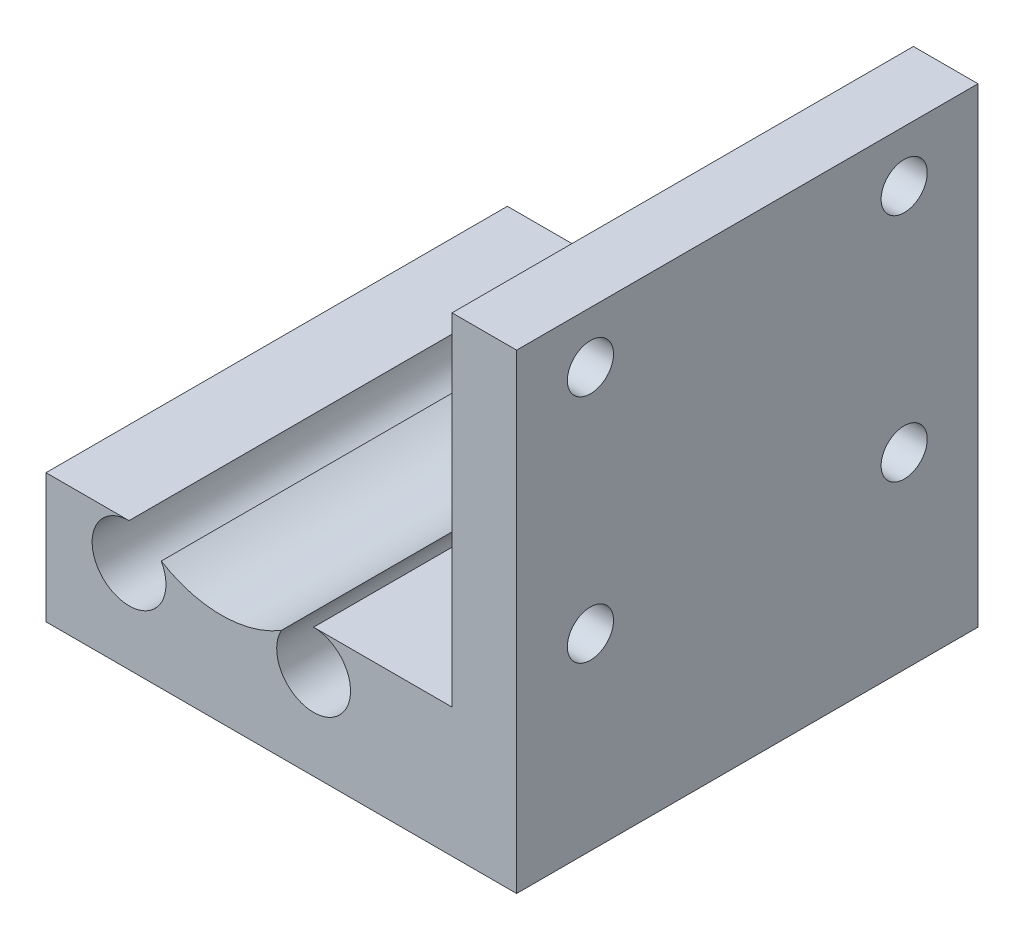
ISO-10303-21;
HEADER;
FILE_DESCRIPTION(('STEP AP214'),'2;1');
FILE_NAME('part.step','',(''),(''),'','','');
FILE_SCHEMA(('AUTOMOTIVE_DESIGN { 1 0 10303 214 1 1 1 1 }'));
ENDSEC;
DATA;
#1=APPLICATION_CONTEXT('core data for automotive mechanical design processes');
#2=APPLICATION_PROTOCOL_DEFINITION('international standard','automotive_design',2000,#1);
#3=PRODUCT_CONTEXT('',#1,'mechanical');
#4=PRODUCT('Part','Part','',(#3));
#5=PRODUCT_RELATED_PRODUCT_CATEGORY('part','',(#4));
#6=PRODUCT_DEFINITION_FORMATION('','',#4);
#7=PRODUCT_DEFINITION_CONTEXT('part definition',#1,'design');
#8=PRODUCT_DEFINITION('design','',#6,#7);
#9=PRODUCT_DEFINITION_SHAPE('','',#8);
#10=(LENGTH_UNIT() NAMED_UNIT(*) SI_UNIT(.MILLI.,.METRE.));
#11=(NAMED_UNIT(*) PLANE_ANGLE_UNIT() SI_UNIT($,.RADIAN.));
#12=(NAMED_UNIT(*) SI_UNIT($,.STERADIAN.) SOLID_ANGLE_UNIT());
#13=UNCERTAINTY_MEASURE_WITH_UNIT(LENGTH_MEASURE(1.E-05),#10,'distance_accuracy_value','');
#14=(GEOMETRIC_REPRESENTATION_CONTEXT(3) GLOBAL_UNCERTAINTY_ASSIGNED_CONTEXT((#13)) GLOBAL_UNIT_ASSIGNED_CONTEXT((#10,
#11,#12)) REPRESENTATION_CONTEXT('',''));
#15=CARTESIAN_POINT('',(0.,0.,0.));
#16=DIRECTION('',(0.,0.,1.));
#17=DIRECTION('',(1.,0.,0.));
#18=AXIS2_PLACEMENT_3D('',#15,#16,#17);
#19=CARTESIAN_POINT('',(-10.,-13.1244047484067,25.));
#20=DIRECTION('',(0.,0.,-1.));
#21=DIRECTION('',(-1.,0.,0.));
#22=AXIS2_PLACEMENT_3D('',#19,#20,#21);
#23=CYLINDRICAL_SURFACE('',#22,4.);
#24=CARTESIAN_POINT('',(-10.,-13.1244047484067,-25.));
#25=DIRECTION('',(0.,0.,-1.));
#26=DIRECTION('',(-1.,0.,0.));
#27=AXIS2_PLACEMENT_3D('',#24,#25,#26);
#28=CIRCLE('',#27,4.);
#29=CARTESIAN_POINT('',(-6.50911973324604,-11.1715209927295,-25.));
#30=VERTEX_POINT('',#29);
#31=CARTESIAN_POINT('',(-10.,-9.12440474840669,-25.));
#32=VERTEX_POINT('',#31);
#33=EDGE_CURVE('E149',#30,#32,#28,.T.);
#34=ORIENTED_EDGE('',*,*,#33,.T.);
#35=DIRECTION('',(0.,0.,-1.));
#36=VECTOR('',#35,1.);
#37=CARTESIAN_POINT('',(-10.,-9.12440474840669,25.));
#38=LINE('',#37,#36);
#39=CARTESIAN_POINT('',(-10.,-9.12440474840669,25.));
#40=VERTEX_POINT('',#39);
#41=EDGE_CURVE('E187',#40,#32,#38,.T.);
#42=ORIENTED_EDGE('',*,*,#41,.F.);
#43=CARTESIAN_POINT('',(-10.,-13.1244047484067,25.));
#44=DIRECTION('',(0.,0.,-1.));
#45=DIRECTION('',(-1.,0.,0.));
#46=AXIS2_PLACEMENT_3D('',#43,#44,#45);
#47=CIRCLE('',#46,4.);
#48=CARTESIAN_POINT('',(-6.50911973324604,-11.1715209927295,25.));
#49=VERTEX_POINT('',#48);
#50=EDGE_CURVE('E168',#49,#40,#47,.T.);
#51=ORIENTED_EDGE('',*,*,#50,.F.);
#52=DIRECTION('',(0.,0.,-1.));
#53=VECTOR('',#52,1.);
#54=CARTESIAN_POINT('',(-6.50911973324604,-11.1715209927295,25.));
#55=LINE('',#54,#53);
#56=EDGE_CURVE('E145',#49,#30,#55,.T.);
#57=ORIENTED_EDGE('',*,*,#56,.T.);
#58=EDGE_LOOP('',(#34,#42,#51,#57));
#59=FACE_BOUND('',#58,.T.);
#60=ADVANCED_FACE('F38',(#59),#23,.F.);
#61=CARTESIAN_POINT('',(-10.,-9.12440474840669,25.));
#62=DIRECTION('',(0.,-1.,0.));
#63=DIRECTION('',(0.,0.,-1.));
#64=AXIS2_PLACEMENT_3D('',#61,#62,#63);
#65=PLANE('',#64);
#66=DIRECTION('',(-1.,0.,0.));
#67=VECTOR('',#66,1.);
#68=CARTESIAN_POINT('',(-10.,-9.12440474840669,-25.));
#69=LINE('',#68,#67);
#70=CARTESIAN_POINT('',(-19.,-9.12440474840669,-25.));
#71=VERTEX_POINT('',#70);
#72=EDGE_CURVE('E152',#32,#71,#69,.T.);
#73=ORIENTED_EDGE('',*,*,#72,.T.);
#74=DIRECTION('',(0.,0.,-1.));
#75=VECTOR('',#74,1.);
#76=CARTESIAN_POINT('',(-19.,-9.12440474840669,25.));
#77=LINE('',#76,#75);
#78=CARTESIAN_POINT('',(-19.,-9.12440474840669,25.));
#79=VERTEX_POINT('',#78);
#80=EDGE_CURVE('E184',#79,#71,#77,.T.);
#81=ORIENTED_EDGE('',*,*,#80,.F.);
#82=DIRECTION('',(-1.,0.,0.));
#83=VECTOR('',#82,1.);
#84=CARTESIAN_POINT('',(-10.,-9.12440474840669,25.));
#85=LINE('',#84,#83);
#86=EDGE_CURVE('E106',#40,#79,#85,.T.);
#87=ORIENTED_EDGE('',*,*,#86,.F.);
#88=ORIENTED_EDGE('',*,*,#41,.T.);
#89=EDGE_LOOP('',(#73,#81,#87,#88));
#90=FACE_BOUND('',#89,.T.);
#91=ADVANCED_FACE('F247',(#90),#65,.F.);
#92=CARTESIAN_POINT('',(-19.,-9.12440474840669,25.));
#93=DIRECTION('',(1.,0.,0.));
#94=DIRECTION('',(0.,0.,-1.));
#95=AXIS2_PLACEMENT_3D('',#92,#93,#94);
#96=PLANE('',#95);
#97=DIRECTION('',(0.,-1.,0.));
#98=VECTOR('',#97,1.);
#99=CARTESIAN_POINT('',(-19.,-9.12440474840669,-25.));
#100=LINE('',#99,#98);
#101=CARTESIAN_POINT('',(-19.,-23.1244047484067,-25.));
#102=VERTEX_POINT('',#101);
#103=EDGE_CURVE('E155',#71,#102,#100,.T.);
#104=ORIENTED_EDGE('',*,*,#103,.T.);
#105=DIRECTION('',(0.,0.,-1.));
#106=VECTOR('',#105,1.);
#107=CARTESIAN_POINT('',(-19.,-23.1244047484067,25.));
#108=LINE('',#107,#106);
#109=CARTESIAN_POINT('',(-19.,-23.1244047484067,25.));
#110=VERTEX_POINT('',#109);
#111=EDGE_CURVE('E181',#110,#102,#108,.T.);
#112=ORIENTED_EDGE('',*,*,#111,.F.);
#113=DIRECTION('',(0.,-1.,0.));
#114=VECTOR('',#113,1.);
#115=CARTESIAN_POINT('',(-19.,-9.12440474840669,25.));
#116=LINE('',#115,#114);
#117=EDGE_CURVE('E301',#79,#110,#116,.T.);
#118=ORIENTED_EDGE('',*,*,#117,.F.);
#119=ORIENTED_EDGE('',*,*,#80,.T.);
#120=EDGE_LOOP('',(#104,#112,#118,#119));
#121=FACE_BOUND('',#120,.T.);
#122=ADVANCED_FACE('F252',(#121),#96,.F.);
#123=CARTESIAN_POINT('',(-19.,-23.1244047484067,25.));
#124=DIRECTION('',(0.,1.,0.));
#125=DIRECTION('',(0.,0.,1.));
#126=AXIS2_PLACEMENT_3D('',#123,#124,#125);
#127=PLANE('',#126);
#128=DIRECTION('',(1.,0.,0.));
#129=VECTOR('',#128,1.);
#130=CARTESIAN_POINT('',(-19.,-23.1244047484067,-25.));
#131=LINE('',#130,#129);
#132=CARTESIAN_POINT('',(32.,-23.1244047484067,-25.));
#133=VERTEX_POINT('',#132);
#134=EDGE_CURVE('E157',#102,#133,#131,.T.);
#135=ORIENTED_EDGE('',*,*,#134,.T.);
#136=DIRECTION('',(0.,0.,-1.));
#137=VECTOR('',#136,1.);
#138=CARTESIAN_POINT('',(32.,-23.1244047484067,25.));
#139=LINE('',#138,#137);
#140=CARTESIAN_POINT('',(32.,-23.1244047484067,25.));
#141=VERTEX_POINT('',#140);
#142=EDGE_CURVE('E178',#141,#133,#139,.T.);
#143=ORIENTED_EDGE('',*,*,#142,.F.);
#144=DIRECTION('',(1.,0.,0.));
#145=VECTOR('',#144,1.);
#146=CARTESIAN_POINT('',(-19.,-23.1244047484067,25.));
#147=LINE('',#146,#145);
#148=EDGE_CURVE('E303',#110,#141,#147,.T.);
#149=ORIENTED_EDGE('',*,*,#148,.F.);
#150=ORIENTED_EDGE('',*,*,#111,.T.);
#151=EDGE_LOOP('',(#135,#143,#149,#150));
#152=FACE_BOUND('',#151,.T.);
#153=ADVANCED_FACE('F319',(#152),#127,.F.);
#154=CARTESIAN_POINT('',(32.,27.8755952515933,25.));
#155=DIRECTION('',(-1.,0.,0.));
#156=DIRECTION('',(0.,-1.,0.));
#157=AXIS2_PLACEMENT_3D('',#154,#155,#156);
#158=PLANE('',#157);
#159=CARTESIAN_POINT('',(32.,22.2755952515933,-17.));
#160=DIRECTION('',(1.,0.,0.));
#161=DIRECTION('',(0.,1.,0.));
#162=AXIS2_PLACEMENT_3D('',#159,#160,#161);
#163=CIRCLE('',#162,2.5);
#164=CARTESIAN_POINT('',(32.,24.7755952515933,-17.));
#165=VERTEX_POINT('',#164);
#166=EDGE_CURVE('E289',#165,#165,#163,.T.);
#167=ORIENTED_EDGE('',*,*,#166,.F.);
#168=EDGE_LOOP('',(#167));
#169=FACE_BOUND('',#168,.T.);
#170=CARTESIAN_POINT('',(32.,-2.72440474840669,17.));
#171=DIRECTION('',(1.,0.,0.));
#172=DIRECTION('',(0.,-1.,0.));
#173=AXIS2_PLACEMENT_3D('',#170,#171,#172);
#174=CIRCLE('',#173,2.5);
#175=CARTESIAN_POINT('',(32.,-0.224404748406688,17.));
#176=VERTEX_POINT('',#175);
#177=EDGE_CURVE('E287',#176,#176,#174,.T.);
#178=ORIENTED_EDGE('',*,*,#177,.F.);
#179=EDGE_LOOP('',(#178));
#180=FACE_BOUND('',#179,.T.);
#181=CARTESIAN_POINT('',(32.,22.2755952515933,17.));
#182=DIRECTION('',(1.,0.,0.));
#183=DIRECTION('',(0.,-1.,0.));
#184=AXIS2_PLACEMENT_3D('',#181,#182,#183);
#185=CIRCLE('',#184,2.5);
#186=CARTESIAN_POINT('',(32.,24.7755952515933,17.));
#187=VERTEX_POINT('',#186);
#188=EDGE_CURVE('E290',#187,#187,#185,.T.);
#189=ORIENTED_EDGE('',*,*,#188,.F.);
#190=EDGE_LOOP('',(#189));
#191=FACE_BOUND('',#190,.T.);
#192=CARTESIAN_POINT('',(32.,-2.72440474840668,-17.));
#193=DIRECTION('',(1.,0.,0.));
#194=DIRECTION('',(0.,1.,0.));
#195=AXIS2_PLACEMENT_3D('',#192,#193,#194);
#196=CIRCLE('',#195,2.5);
#197=CARTESIAN_POINT('',(32.,-0.224404748406684,-17.));
#198=VERTEX_POINT('',#197);
#199=EDGE_CURVE('E153',#198,#198,#196,.T.);
#200=ORIENTED_EDGE('',*,*,#199,.F.);
#201=EDGE_LOOP('',(#200));
#202=FACE_BOUND('',#201,.T.);
#203=DIRECTION('',(0.,1.,0.));
#204=VECTOR('',#203,1.);
#205=CARTESIAN_POINT('',(32.,27.8755952515933,-25.));
#206=LINE('',#205,#204);
#207=CARTESIAN_POINT('',(32.,27.8755952515933,-25.));
#208=VERTEX_POINT('',#207);
#209=EDGE_CURVE('E159',#133,#208,#206,.T.);
#210=ORIENTED_EDGE('',*,*,#209,.T.);
#211=DIRECTION('',(0.,0.,-1.));
#212=VECTOR('',#211,1.);
#213=CARTESIAN_POINT('',(32.,27.8755952515933,25.));
#214=LINE('',#213,#212);
#215=CARTESIAN_POINT('',(32.,27.8755952515933,25.));
#216=VERTEX_POINT('',#215);
#217=EDGE_CURVE('E175',#216,#208,#214,.T.);
#218=ORIENTED_EDGE('',*,*,#217,.F.);
#219=DIRECTION('',(0.,1.,0.));
#220=VECTOR('',#219,1.);
#221=CARTESIAN_POINT('',(32.,27.8755952515933,25.));
#222=LINE('',#221,#220);
#223=EDGE_CURVE('E305',#141,#216,#222,.T.);
#224=ORIENTED_EDGE('',*,*,#223,.F.);
#225=ORIENTED_EDGE('',*,*,#142,.T.);
#226=EDGE_LOOP('',(#210,#218,#224,#225));
#227=FACE_BOUND('',#226,.T.);
#228=ADVANCED_FACE('F315',(#169,#180,#191,#202,#227),#158,.F.);
#229=CARTESIAN_POINT('',(32.,27.8755952515933,25.));
#230=DIRECTION('',(0.,-1.,0.));
#231=DIRECTION('',(0.,0.,-1.));
#232=AXIS2_PLACEMENT_3D('',#229,#230,#231);
#233=PLANE('',#232);
#234=DIRECTION('',(-1.,0.,0.));
#235=VECTOR('',#234,1.);
#236=CARTESIAN_POINT('',(32.,27.8755952515933,-25.));
#237=LINE('',#236,#235);
#238=CARTESIAN_POINT('',(25.,27.8755952515933,-25.));
#239=VERTEX_POINT('',#238);
#240=EDGE_CURVE('E161',#208,#239,#237,.T.);
#241=ORIENTED_EDGE('',*,*,#240,.T.);
#242=DIRECTION('',(0.,0.,-1.));
#243=VECTOR('',#242,1.);
#244=CARTESIAN_POINT('',(25.,27.8755952515933,25.));
#245=LINE('',#244,#243);
#246=CARTESIAN_POINT('',(25.,27.8755952515933,25.));
#247=VERTEX_POINT('',#246);
#248=EDGE_CURVE('E172',#247,#239,#245,.T.);
#249=ORIENTED_EDGE('',*,*,#248,.F.);
#250=DIRECTION('',(-1.,0.,0.));
#251=VECTOR('',#250,1.);
#252=CARTESIAN_POINT('',(32.,27.8755952515933,25.));
#253=LINE('',#252,#251);
#254=EDGE_CURVE('E307',#216,#247,#253,.T.);
#255=ORIENTED_EDGE('',*,*,#254,.F.);
#256=ORIENTED_EDGE('',*,*,#217,.T.);
#257=EDGE_LOOP('',(#241,#249,#255,#256));
#258=FACE_BOUND('',#257,.T.);
#259=ADVANCED_FACE('F221',(#258),#233,.F.);
#260=CARTESIAN_POINT('',(25.,27.8755952515933,25.));
#261=DIRECTION('',(1.,0.,0.));
#262=DIRECTION('',(0.,1.,0.));
#263=AXIS2_PLACEMENT_3D('',#260,#261,#262);
#264=PLANE('',#263);
#265=CARTESIAN_POINT('',(25.,-2.72440474840668,-17.));
#266=DIRECTION('',(1.,0.,0.));
#267=DIRECTION('',(0.,1.,0.));
#268=AXIS2_PLACEMENT_3D('',#265,#266,#267);
#269=CIRCLE('',#268,5.19999999999995);
#270=CARTESIAN_POINT('',(25.,2.47559525159326,-17.));
#271=VERTEX_POINT('',#270);
#272=EDGE_CURVE('E198',#271,#271,#269,.T.);
#273=ORIENTED_EDGE('',*,*,#272,.T.);
#274=EDGE_LOOP('',(#273));
#275=FACE_BOUND('',#274,.T.);
#276=CARTESIAN_POINT('',(25.,-2.72440474840669,17.));
#277=DIRECTION('',(1.,0.,0.));
#278=DIRECTION('',(0.,1.,0.));
#279=AXIS2_PLACEMENT_3D('',#276,#277,#278);
#280=CIRCLE('',#279,5.19999999999995);
#281=CARTESIAN_POINT('',(25.,2.47559525159326,17.));
#282=VERTEX_POINT('',#281);
#283=EDGE_CURVE('E195',#282,#282,#280,.T.);
#284=ORIENTED_EDGE('',*,*,#283,.T.);
#285=EDGE_LOOP('',(#284));
#286=FACE_BOUND('',#285,.T.);
#287=CARTESIAN_POINT('',(25.,22.2755952515933,17.));
#288=DIRECTION('',(1.,0.,0.));
#289=DIRECTION('',(0.,1.,0.));
#290=AXIS2_PLACEMENT_3D('',#287,#288,#289);
#291=CIRCLE('',#290,5.19999999999998);
#292=CARTESIAN_POINT('',(25.,27.4755952515933,17.));
#293=VERTEX_POINT('',#292);
#294=EDGE_CURVE('E192',#293,#293,#291,.T.);
#295=ORIENTED_EDGE('',*,*,#294,.T.);
#296=EDGE_LOOP('',(#295));
#297=FACE_BOUND('',#296,.T.);
#298=CARTESIAN_POINT('',(25.,22.2755952515933,-17.));
#299=DIRECTION('',(1.,0.,0.));
#300=DIRECTION('',(0.,1.,0.));
#301=AXIS2_PLACEMENT_3D('',#298,#299,#300);
#302=CIRCLE('',#301,5.19999999999998);
#303=CARTESIAN_POINT('',(25.,27.4755952515933,-17.));
#304=VERTEX_POINT('',#303);
#305=EDGE_CURVE('E189',#304,#304,#302,.T.);
#306=ORIENTED_EDGE('',*,*,#305,.T.);
#307=EDGE_LOOP('',(#306));
#308=FACE_BOUND('',#307,.T.);
#309=DIRECTION('',(0.,-1.,0.));
#310=VECTOR('',#309,1.);
#311=CARTESIAN_POINT('',(25.,27.8755952515933,-25.));
#312=LINE('',#311,#310);
#313=CARTESIAN_POINT('',(25.,-9.12440474840668,-25.));
#314=VERTEX_POINT('',#313);
#315=EDGE_CURVE('E163',#239,#314,#312,.T.);
#316=ORIENTED_EDGE('',*,*,#315,.T.);
#317=DIRECTION('',(0.,0.,-1.));
#318=VECTOR('',#317,1.);
#319=CARTESIAN_POINT('',(25.,-9.12440474840668,25.));
#320=LINE('',#319,#318);
#321=CARTESIAN_POINT('',(25.,-9.12440474840668,25.));
#322=VERTEX_POINT('',#321);
#323=EDGE_CURVE('E140',#322,#314,#320,.T.);
#324=ORIENTED_EDGE('',*,*,#323,.F.);
#325=DIRECTION('',(0.,-1.,0.));
#326=VECTOR('',#325,1.);
#327=CARTESIAN_POINT('',(25.,27.8755952515933,25.));
#328=LINE('',#327,#326);
#329=EDGE_CURVE('E131',#247,#322,#328,.T.);
#330=ORIENTED_EDGE('',*,*,#329,.F.);
#331=ORIENTED_EDGE('',*,*,#248,.T.);
#332=EDGE_LOOP('',(#316,#324,#330,#331));
#333=FACE_BOUND('',#332,.T.);
#334=ADVANCED_FACE('F218',(#275,#286,#297,#308,#333),#264,.F.);
#335=CARTESIAN_POINT('',(25.,-9.12440474840668,25.));
#336=DIRECTION('',(0.,-1.,0.));
#337=DIRECTION('',(1.,0.,0.));
#338=AXIS2_PLACEMENT_3D('',#335,#336,#337);
#339=PLANE('',#338);
#340=DIRECTION('',(-1.,0.,0.));
#341=VECTOR('',#340,1.);
#342=CARTESIAN_POINT('',(25.,-9.12440474840668,-25.));
#343=LINE('',#342,#341);
#344=CARTESIAN_POINT('',(10.,-9.12440474840669,-25.));
#345=VERTEX_POINT('',#344);
#346=EDGE_CURVE('E139',#314,#345,#343,.T.);
#347=ORIENTED_EDGE('',*,*,#346,.T.);
#348=DIRECTION('',(0.,0.,-1.));
#349=VECTOR('',#348,1.);
#350=CARTESIAN_POINT('',(10.,-9.12440474840669,25.));
#351=LINE('',#350,#349);
#352=CARTESIAN_POINT('',(10.,-9.12440474840669,25.));
#353=VERTEX_POINT('',#352);
#354=EDGE_CURVE('E136',#353,#345,#351,.T.);
#355=ORIENTED_EDGE('',*,*,#354,.F.);
#356=DIRECTION('',(-1.,0.,0.));
#357=VECTOR('',#356,1.);
#358=CARTESIAN_POINT('',(25.,-9.12440474840668,25.));
#359=LINE('',#358,#357);
#360=EDGE_CURVE('E125',#322,#353,#359,.T.);
#361=ORIENTED_EDGE('',*,*,#360,.F.);
#362=ORIENTED_EDGE('',*,*,#323,.T.);
#363=EDGE_LOOP('',(#347,#355,#361,#362));
#364=FACE_BOUND('',#363,.T.);
#365=ADVANCED_FACE('F137',(#364),#339,.F.);
#366=CARTESIAN_POINT('',(10.,-13.1244047484067,25.));
#367=DIRECTION('',(0.,0.,-1.));
#368=DIRECTION('',(-1.,0.,0.));
#369=AXIS2_PLACEMENT_3D('',#366,#367,#368);
#370=CYLINDRICAL_SURFACE('',#369,4.);
#371=CARTESIAN_POINT('',(10.,-13.1244047484067,-25.));
#372=DIRECTION('',(0.,0.,-1.));
#373=DIRECTION('',(1.,0.,0.));
#374=AXIS2_PLACEMENT_3D('',#371,#372,#373);
#375=CIRCLE('',#374,4.);
#376=CARTESIAN_POINT('',(6.50911973324603,-11.1715209927295,-25.));
#377=VERTEX_POINT('',#376);
#378=EDGE_CURVE('E91',#345,#377,#375,.T.);
#379=ORIENTED_EDGE('',*,*,#378,.T.);
#380=DIRECTION('',(0.,0.,-1.));
#381=VECTOR('',#380,1.);
#382=CARTESIAN_POINT('',(6.50911973324603,-11.1715209927295,25.));
#383=LINE('',#382,#381);
#384=CARTESIAN_POINT('',(6.50911973324603,-11.1715209927295,25.));
#385=VERTEX_POINT('',#384);
#386=EDGE_CURVE('E141',#385,#377,#383,.T.);
#387=ORIENTED_EDGE('',*,*,#386,.F.);
#388=CARTESIAN_POINT('',(10.,-13.1244047484067,25.));
#389=DIRECTION('',(0.,0.,-1.));
#390=DIRECTION('',(1.,0.,0.));
#391=AXIS2_PLACEMENT_3D('',#388,#389,#390);
#392=CIRCLE('',#391,4.);
#393=EDGE_CURVE('E129',#353,#385,#392,.T.);
#394=ORIENTED_EDGE('',*,*,#393,.F.);
#395=ORIENTED_EDGE('',*,*,#354,.T.);
#396=EDGE_LOOP('',(#379,#387,#394,#395));
#397=FACE_BOUND('',#396,.T.);
#398=ADVANCED_FACE('F143',(#397),#370,.F.);
#399=CARTESIAN_POINT('',(0.,-0.5,25.));
#400=DIRECTION('',(0.,0.,-1.));
#401=DIRECTION('',(-1.,0.,0.));
#402=AXIS2_PLACEMENT_3D('',#399,#400,#401);
#403=CYLINDRICAL_SURFACE('',#402,12.5);
#404=CARTESIAN_POINT('',(0.,-0.5,-25.));
#405=DIRECTION('',(0.,0.,-1.));
#406=DIRECTION('',(1.,0.,0.));
#407=AXIS2_PLACEMENT_3D('',#404,#405,#406);
#408=CIRCLE('',#407,12.5);
#409=EDGE_CURVE('E97',#377,#30,#408,.T.);
#410=ORIENTED_EDGE('',*,*,#409,.T.);
#411=ORIENTED_EDGE('',*,*,#56,.F.);
#412=CARTESIAN_POINT('',(0.,-0.5,25.));
#413=DIRECTION('',(0.,0.,-1.));
#414=DIRECTION('',(1.,0.,0.));
#415=AXIS2_PLACEMENT_3D('',#412,#413,#414);
#416=CIRCLE('',#415,12.5);
#417=EDGE_CURVE('E56',#385,#49,#416,.T.);
#418=ORIENTED_EDGE('',*,*,#417,.F.);
#419=ORIENTED_EDGE('',*,*,#386,.T.);
#420=EDGE_LOOP('',(#410,#411,#418,#419));
#421=FACE_BOUND('',#420,.T.);
#422=ADVANCED_FACE('F236',(#421),#403,.F.);
#423=CARTESIAN_POINT('',(-10.,-13.1244047484067,25.));
#424=DIRECTION('',(0.,0.,-1.));
#425=DIRECTION('',(-1.,0.,0.));
#426=AXIS2_PLACEMENT_3D('',#423,#424,#425);
#427=PLANE('',#426);
#428=ORIENTED_EDGE('',*,*,#50,.T.);
#429=ORIENTED_EDGE('',*,*,#86,.T.);
#430=ORIENTED_EDGE('',*,*,#117,.T.);
#431=ORIENTED_EDGE('',*,*,#148,.T.);
#432=ORIENTED_EDGE('',*,*,#223,.T.);
#433=ORIENTED_EDGE('',*,*,#254,.T.);
#434=ORIENTED_EDGE('',*,*,#329,.T.);
#435=ORIENTED_EDGE('',*,*,#360,.T.);
#436=ORIENTED_EDGE('',*,*,#393,.T.);
#437=ORIENTED_EDGE('',*,*,#417,.T.);
#438=EDGE_LOOP('',(#428,#429,#430,#431,#432,#433,#434,#435,#436,#437));
#439=FACE_BOUND('',#438,.T.);
#440=ADVANCED_FACE('F127',(#439),#427,.F.);
#441=CARTESIAN_POINT('',(-10.,-13.1244047484067,-25.));
#442=DIRECTION('',(0.,0.,-1.));
#443=DIRECTION('',(-1.,0.,0.));
#444=AXIS2_PLACEMENT_3D('',#441,#442,#443);
#445=PLANE('',#444);
#446=ORIENTED_EDGE('',*,*,#33,.F.);
#447=ORIENTED_EDGE('',*,*,#409,.F.);
#448=ORIENTED_EDGE('',*,*,#378,.F.);
#449=ORIENTED_EDGE('',*,*,#346,.F.);
#450=ORIENTED_EDGE('',*,*,#315,.F.);
#451=ORIENTED_EDGE('',*,*,#240,.F.);
#452=ORIENTED_EDGE('',*,*,#209,.F.);
#453=ORIENTED_EDGE('',*,*,#134,.F.);
#454=ORIENTED_EDGE('',*,*,#103,.F.);
#455=ORIENTED_EDGE('',*,*,#72,.F.);
#456=EDGE_LOOP('',(#446,#447,#448,#449,#450,#451,#452,#453,#454,#455));
#457=FACE_BOUND('',#456,.T.);
#458=ADVANCED_FACE('F231',(#457),#445,.T.);
#459=CARTESIAN_POINT('',(-58.,-2.72440474840669,-17.));
#460=DIRECTION('',(1.,0.,0.));
#461=DIRECTION('',(0.,1.,0.));
#462=AXIS2_PLACEMENT_3D('',#459,#460,#461);
#463=CYLINDRICAL_SURFACE('',#462,2.5);
#464=CARTESIAN_POINT('',(27.6999999999999,-2.72440474840668,-17.));
#465=DIRECTION('',(1.,0.,0.));
#466=DIRECTION('',(0.,1.,0.));
#467=AXIS2_PLACEMENT_3D('',#464,#465,#466);
#468=CIRCLE('',#467,2.5);
#469=CARTESIAN_POINT('',(27.6999999999999,-0.224404748406684,-17.));
#470=VERTEX_POINT('',#469);
#471=EDGE_CURVE('E201',#470,#470,#468,.F.);
#472=CARTESIAN_POINT('',(27.6999999999999,-0.224404748406684,-17.));
#473=CARTESIAN_POINT('',(27.7447916666666,-0.224404748406684,-17.));
#474=CARTESIAN_POINT('',(27.7895833333332,-0.224404748406684,-17.));
#475=CARTESIAN_POINT('',(27.8791666666666,-0.224404748406684,-17.));
#476=CARTESIAN_POINT('',(27.9239583333332,-0.224404748406684,-17.));
#477=CARTESIAN_POINT('',(28.0135416666666,-0.224404748406684,-17.));
#478=CARTESIAN_POINT('',(28.0583333333332,-0.224404748406684,-17.));
#479=CARTESIAN_POINT('',(28.1479166666666,-0.224404748406684,-17.));
#480=CARTESIAN_POINT('',(28.1927083333332,-0.224404748406684,-17.));
#481=CARTESIAN_POINT('',(28.2822916666666,-0.224404748406684,-17.));
#482=CARTESIAN_POINT('',(28.3270833333333,-0.224404748406684,-17.));
#483=CARTESIAN_POINT('',(28.4166666666666,-0.224404748406684,-17.));
#484=CARTESIAN_POINT('',(28.4614583333332,-0.224404748406684,-17.));
#485=CARTESIAN_POINT('',(28.5510416666666,-0.224404748406684,-17.));
#486=CARTESIAN_POINT('',(28.5958333333332,-0.224404748406684,-17.));
#487=CARTESIAN_POINT('',(28.6854166666666,-0.224404748406684,-17.));
#488=CARTESIAN_POINT('',(28.7302083333333,-0.224404748406684,-17.));
#489=CARTESIAN_POINT('',(28.8197916666666,-0.224404748406684,-17.));
#490=CARTESIAN_POINT('',(28.8645833333333,-0.224404748406684,-17.));
#491=CARTESIAN_POINT('',(28.9541666666666,-0.224404748406684,-17.));
#492=CARTESIAN_POINT('',(28.9989583333333,-0.224404748406684,-17.));
#493=CARTESIAN_POINT('',(29.0885416666666,-0.224404748406684,-17.));
#494=CARTESIAN_POINT('',(29.1333333333333,-0.224404748406684,-17.));
#495=CARTESIAN_POINT('',(29.2229166666666,-0.224404748406684,-17.));
#496=CARTESIAN_POINT('',(29.2677083333333,-0.224404748406684,-17.));
#497=CARTESIAN_POINT('',(29.3572916666666,-0.224404748406684,-17.));
#498=CARTESIAN_POINT('',(29.4020833333333,-0.224404748406684,-17.));
#499=CARTESIAN_POINT('',(29.4916666666666,-0.224404748406684,-17.));
#500=CARTESIAN_POINT('',(29.5364583333333,-0.224404748406684,-17.));
#501=CARTESIAN_POINT('',(29.6260416666666,-0.224404748406684,-17.));
#502=CARTESIAN_POINT('',(29.6708333333333,-0.224404748406684,-17.));
#503=CARTESIAN_POINT('',(29.7604166666666,-0.224404748406684,-17.));
#504=CARTESIAN_POINT('',(29.8052083333333,-0.224404748406684,-17.));
#505=CARTESIAN_POINT('',(29.8947916666666,-0.224404748406684,-17.));
#506=CARTESIAN_POINT('',(29.9395833333333,-0.224404748406684,-17.));
#507=CARTESIAN_POINT('',(30.0291666666666,-0.224404748406684,-17.));
#508=CARTESIAN_POINT('',(30.0739583333333,-0.224404748406684,-17.));
#509=CARTESIAN_POINT('',(30.1635416666666,-0.224404748406684,-17.));
#510=CARTESIAN_POINT('',(30.2083333333333,-0.224404748406684,-17.));
#511=CARTESIAN_POINT('',(30.2979166666666,-0.224404748406684,-17.));
#512=CARTESIAN_POINT('',(30.3427083333333,-0.224404748406684,-17.));
#513=CARTESIAN_POINT('',(30.4322916666666,-0.224404748406684,-17.));
#514=CARTESIAN_POINT('',(30.4770833333333,-0.224404748406684,-17.));
#515=CARTESIAN_POINT('',(30.5666666666666,-0.224404748406684,-17.));
#516=CARTESIAN_POINT('',(30.6114583333333,-0.224404748406684,-17.));
#517=CARTESIAN_POINT('',(30.7010416666666,-0.224404748406684,-17.));
#518=CARTESIAN_POINT('',(30.7458333333333,-0.224404748406684,-17.));
#519=CARTESIAN_POINT('',(30.8354166666666,-0.224404748406684,-17.));
#520=CARTESIAN_POINT('',(30.8802083333333,-0.224404748406684,-17.));
#521=CARTESIAN_POINT('',(30.9697916666666,-0.224404748406684,-17.));
#522=CARTESIAN_POINT('',(31.0145833333333,-0.224404748406684,-17.));
#523=CARTESIAN_POINT('',(31.1041666666666,-0.224404748406684,-17.));
#524=CARTESIAN_POINT('',(31.1489583333333,-0.224404748406684,-17.));
#525=CARTESIAN_POINT('',(31.2385416666666,-0.224404748406684,-17.));
#526=CARTESIAN_POINT('',(31.2833333333333,-0.224404748406684,-17.));
#527=CARTESIAN_POINT('',(31.3729166666666,-0.224404748406684,-17.));
#528=CARTESIAN_POINT('',(31.4177083333333,-0.224404748406684,-17.));
#529=CARTESIAN_POINT('',(31.5072916666666,-0.224404748406684,-17.));
#530=CARTESIAN_POINT('',(31.5520833333333,-0.224404748406684,-17.));
#531=CARTESIAN_POINT('',(31.6416666666666,-0.224404748406684,-17.));
#532=CARTESIAN_POINT('',(31.6864583333333,-0.224404748406684,-17.));
#533=CARTESIAN_POINT('',(31.7760416666666,-0.224404748406684,-17.));
#534=CARTESIAN_POINT('',(31.8208333333333,-0.224404748406684,-17.));
#535=CARTESIAN_POINT('',(31.9104166666666,-0.224404748406684,-17.));
#536=CARTESIAN_POINT('',(31.9552083333333,-0.224404748406684,-17.));
#537=CARTESIAN_POINT('',(32.,-0.224404748406684,-17.));
#538=B_SPLINE_CURVE_WITH_KNOTS('',3,(#472,#473,#474,#475,#476,#477,#478,#479,#480,#481,#482,
#483,#484,#485,#486,#487,#488,#489,#490,#491,#492,#493,#494,#495,#496,#497,#498,#499,#500,#501,
#502,#503,#504,#505,#506,#507,#508,#509,#510,#511,#512,#513,#514,#515,#516,#517,#518,#519,#520,
#521,#522,#523,#524,#525,#526,#527,#528,#529,#530,#531,#532,#533,#534,#535,#536,#537),
.UNSPECIFIED.,.F.,.F.,(4,2,2,2,2,2,2,2,2,2,2,2,2,2,2,2,2,2,2,2,2,2,2,2,2,2,2,2,2,2,2,2,4),(0.,
0.134375000000006,0.268750000000012,0.403125000000004,0.53750000000001,0.671875000000016,
0.806250000000008,0.940625000000014,1.07500000000002,1.20937500000003,1.34375000000003,
1.47812500000002,1.61250000000003,1.74687500000004,1.88125000000003,2.01562500000003,
2.15000000000004,2.28437500000005,2.41875000000005,2.55312500000004,2.68750000000005,
2.82187500000006,2.95625000000005,3.09062500000006,3.22500000000006,3.35937500000007,
3.49375000000007,3.62812500000007,3.76250000000007,3.89687500000008,4.03125000000007,
4.16562500000008,4.30000000000008),.UNSPECIFIED.);
#539=EDGE_CURVE('BSEAM363',#470,#198,#538,.T.);
#540=ORIENTED_EDGE('',*,*,#471,.T.);
#541=ORIENTED_EDGE('',*,*,#199,.T.);
#542=ORIENTED_EDGE('',*,*,#539,.T.);
#543=ORIENTED_EDGE('',*,*,#539,.F.);
#544=EDGE_LOOP('',(#540,#542,#541,#543));
#545=FACE_BOUND('',#544,.T.);
#546=ADVANCED_FACE('F363',(#545),#463,.F.);
#547=CARTESIAN_POINT('',(-58.,22.2755952515933,17.));
#548=DIRECTION('',(1.,0.,0.));
#549=DIRECTION('',(0.,1.,0.));
#550=AXIS2_PLACEMENT_3D('',#547,#548,#549);
#551=CYLINDRICAL_SURFACE('',#550,2.5);
#552=CARTESIAN_POINT('',(27.6999999999999,22.2755952515933,17.));
#553=DIRECTION('',(1.,0.,0.));
#554=DIRECTION('',(0.,0.,-1.));
#555=AXIS2_PLACEMENT_3D('',#552,#553,#554);
#556=CIRCLE('',#555,2.5);
#557=CARTESIAN_POINT('',(27.6999999999999,24.7755952515933,17.));
#558=VERTEX_POINT('',#557);
#559=EDGE_CURVE('E48',#558,#558,#556,.F.);
#560=CARTESIAN_POINT('',(27.6999999999999,24.7755952515933,17.));
#561=CARTESIAN_POINT('',(27.7447916666666,24.7755952515933,17.));
#562=CARTESIAN_POINT('',(27.7895833333333,24.7755952515933,17.));
#563=CARTESIAN_POINT('',(27.8791666666666,24.7755952515933,17.));
#564=CARTESIAN_POINT('',(27.9239583333333,24.7755952515933,17.));
#565=CARTESIAN_POINT('',(28.0135416666666,24.7755952515933,17.));
#566=CARTESIAN_POINT('',(28.0583333333333,24.7755952515933,17.));
#567=CARTESIAN_POINT('',(28.1479166666666,24.7755952515933,17.));
#568=CARTESIAN_POINT('',(28.1927083333333,24.7755952515933,17.));
#569=CARTESIAN_POINT('',(28.2822916666666,24.7755952515933,17.));
#570=CARTESIAN_POINT('',(28.3270833333333,24.7755952515933,17.));
#571=CARTESIAN_POINT('',(28.4166666666666,24.7755952515933,17.));
#572=CARTESIAN_POINT('',(28.4614583333333,24.7755952515933,17.));
#573=CARTESIAN_POINT('',(28.5510416666666,24.7755952515933,17.));
#574=CARTESIAN_POINT('',(28.5958333333333,24.7755952515933,17.));
#575=CARTESIAN_POINT('',(28.6854166666666,24.7755952515933,17.));
#576=CARTESIAN_POINT('',(28.7302083333333,24.7755952515933,17.));
#577=CARTESIAN_POINT('',(28.8197916666666,24.7755952515933,17.));
#578=CARTESIAN_POINT('',(28.8645833333333,24.7755952515933,17.));
#579=CARTESIAN_POINT('',(28.9541666666666,24.7755952515933,17.));
#580=CARTESIAN_POINT('',(28.9989583333333,24.7755952515933,17.));
#581=CARTESIAN_POINT('',(29.0885416666666,24.7755952515933,17.));
#582=CARTESIAN_POINT('',(29.1333333333333,24.7755952515933,17.));
#583=CARTESIAN_POINT('',(29.2229166666666,24.7755952515933,17.));
#584=CARTESIAN_POINT('',(29.2677083333333,24.7755952515933,17.));
#585=CARTESIAN_POINT('',(29.3572916666666,24.7755952515933,17.));
#586=CARTESIAN_POINT('',(29.4020833333333,24.7755952515933,17.));
#587=CARTESIAN_POINT('',(29.4916666666666,24.7755952515933,17.));
#588=CARTESIAN_POINT('',(29.5364583333333,24.7755952515933,17.));
#589=CARTESIAN_POINT('',(29.6260416666666,24.7755952515933,17.));
#590=CARTESIAN_POINT('',(29.6708333333333,24.7755952515933,17.));
#591=CARTESIAN_POINT('',(29.7604166666666,24.7755952515933,17.));
#592=CARTESIAN_POINT('',(29.8052083333333,24.7755952515933,17.));
#593=CARTESIAN_POINT('',(29.8947916666666,24.7755952515933,17.));
#594=CARTESIAN_POINT('',(29.9395833333333,24.7755952515933,17.));
#595=CARTESIAN_POINT('',(30.0291666666666,24.7755952515933,17.));
#596=CARTESIAN_POINT('',(30.0739583333333,24.7755952515933,17.));
#597=CARTESIAN_POINT('',(30.1635416666666,24.7755952515933,17.));
#598=CARTESIAN_POINT('',(30.2083333333333,24.7755952515933,17.));
#599=CARTESIAN_POINT('',(30.2979166666666,24.7755952515933,17.));
#600=CARTESIAN_POINT('',(30.3427083333333,24.7755952515933,17.));
#601=CARTESIAN_POINT('',(30.4322916666666,24.7755952515933,17.));
#602=CARTESIAN_POINT('',(30.4770833333333,24.7755952515933,17.));
#603=CARTESIAN_POINT('',(30.5666666666666,24.7755952515933,17.));
#604=CARTESIAN_POINT('',(30.6114583333333,24.7755952515933,17.));
#605=CARTESIAN_POINT('',(30.7010416666666,24.7755952515933,17.));
#606=CARTESIAN_POINT('',(30.7458333333333,24.7755952515933,17.));
#607=CARTESIAN_POINT('',(30.8354166666666,24.7755952515933,17.));
#608=CARTESIAN_POINT('',(30.8802083333333,24.7755952515933,17.));
#609=CARTESIAN_POINT('',(30.9697916666666,24.7755952515933,17.));
#610=CARTESIAN_POINT('',(31.0145833333333,24.7755952515933,17.));
#611=CARTESIAN_POINT('',(31.1041666666666,24.7755952515933,17.));
#612=CARTESIAN_POINT('',(31.1489583333333,24.7755952515933,17.));
#613=CARTESIAN_POINT('',(31.2385416666666,24.7755952515933,17.));
#614=CARTESIAN_POINT('',(31.2833333333333,24.7755952515933,17.));
#615=CARTESIAN_POINT('',(31.3729166666666,24.7755952515933,17.));
#616=CARTESIAN_POINT('',(31.4177083333333,24.7755952515933,17.));
#617=CARTESIAN_POINT('',(31.5072916666666,24.7755952515933,17.));
#618=CARTESIAN_POINT('',(31.5520833333333,24.7755952515933,17.));
#619=CARTESIAN_POINT('',(31.6416666666667,24.7755952515933,17.));
#620=CARTESIAN_POINT('',(31.6864583333333,24.7755952515933,17.));
#621=CARTESIAN_POINT('',(31.7760416666667,24.7755952515933,17.));
#622=CARTESIAN_POINT('',(31.8208333333333,24.7755952515933,17.));
#623=CARTESIAN_POINT('',(31.9104166666666,24.7755952515933,17.));
#624=CARTESIAN_POINT('',(31.9552083333333,24.7755952515933,17.));
#625=CARTESIAN_POINT('',(32.,24.7755952515933,17.));
#626=B_SPLINE_CURVE_WITH_KNOTS('',3,(#560,#561,#562,#563,#564,#565,#566,#567,#568,#569,#570,
#571,#572,#573,#574,#575,#576,#577,#578,#579,#580,#581,#582,#583,#584,#585,#586,#587,#588,#589,
#590,#591,#592,#593,#594,#595,#596,#597,#598,#599,#600,#601,#602,#603,#604,#605,#606,#607,#608,
#609,#610,#611,#612,#613,#614,#615,#616,#617,#618,#619,#620,#621,#622,#623,#624,#625),
.UNSPECIFIED.,.F.,.F.,(4,2,2,2,2,2,2,2,2,2,2,2,2,2,2,2,2,2,2,2,2,2,2,2,2,2,2,2,2,2,2,2,4),(0.,
0.134375000000006,0.268749999999998,0.403125000000004,0.53750000000001,0.671875000000002,
0.806250000000008,0.940625000000014,1.07500000000002,1.20937500000001,1.34375000000002,
1.47812500000002,1.61250000000002,1.74687500000002,1.88125000000003,2.01562500000002,
2.15000000000003,2.28437500000003,2.41875000000003,2.55312500000003,2.68750000000004,
2.82187500000003,2.95625000000004,3.09062500000004,3.22500000000003,3.35937500000004,
3.49375000000005,3.62812500000005,3.76250000000004,3.89687500000005,4.03125000000006,
4.16562500000005,4.30000000000005),.UNSPECIFIED.);
#627=EDGE_CURVE('BSEAM209',#558,#187,#626,.T.);
#628=ORIENTED_EDGE('',*,*,#559,.T.);
#629=ORIENTED_EDGE('',*,*,#188,.T.);
#630=ORIENTED_EDGE('',*,*,#627,.T.);
#631=ORIENTED_EDGE('',*,*,#627,.F.);
#632=EDGE_LOOP('',(#628,#630,#629,#631));
#633=FACE_BOUND('',#632,.T.);
#634=ADVANCED_FACE('F209',(#633),#551,.F.);
#635=CARTESIAN_POINT('',(-58.,-2.7244047484067,17.));
#636=DIRECTION('',(1.,0.,0.));
#637=DIRECTION('',(0.,1.,0.));
#638=AXIS2_PLACEMENT_3D('',#635,#636,#637);
#639=CYLINDRICAL_SURFACE('',#638,2.5);
#640=CARTESIAN_POINT('',(27.6999999999999,-2.72440474840669,17.));
#641=DIRECTION('',(1.,0.,0.));
#642=DIRECTION('',(0.,1.,0.));
#643=AXIS2_PLACEMENT_3D('',#640,#641,#642);
#644=CIRCLE('',#643,2.5);
#645=CARTESIAN_POINT('',(27.6999999999999,-0.224404748406689,17.));
#646=VERTEX_POINT('',#645);
#647=EDGE_CURVE('E204',#646,#646,#644,.F.);
#648=CARTESIAN_POINT('',(27.6999999999999,-0.224404748406689,17.));
#649=CARTESIAN_POINT('',(27.7447916666666,-0.224404748406689,17.));
#650=CARTESIAN_POINT('',(27.7895833333332,-0.224404748406689,17.));
#651=CARTESIAN_POINT('',(27.8791666666666,-0.224404748406689,17.));
#652=CARTESIAN_POINT('',(27.9239583333332,-0.224404748406689,17.));
#653=CARTESIAN_POINT('',(28.0135416666666,-0.224404748406689,17.));
#654=CARTESIAN_POINT('',(28.0583333333332,-0.224404748406689,17.));
#655=CARTESIAN_POINT('',(28.1479166666666,-0.224404748406689,17.));
#656=CARTESIAN_POINT('',(28.1927083333332,-0.224404748406689,17.));
#657=CARTESIAN_POINT('',(28.2822916666666,-0.224404748406689,17.));
#658=CARTESIAN_POINT('',(28.3270833333333,-0.224404748406689,17.));
#659=CARTESIAN_POINT('',(28.4166666666666,-0.224404748406689,17.));
#660=CARTESIAN_POINT('',(28.4614583333332,-0.224404748406689,17.));
#661=CARTESIAN_POINT('',(28.5510416666666,-0.224404748406689,17.));
#662=CARTESIAN_POINT('',(28.5958333333332,-0.224404748406689,17.));
#663=CARTESIAN_POINT('',(28.6854166666666,-0.224404748406689,17.));
#664=CARTESIAN_POINT('',(28.7302083333333,-0.224404748406689,17.));
#665=CARTESIAN_POINT('',(28.8197916666666,-0.224404748406689,17.));
#666=CARTESIAN_POINT('',(28.8645833333333,-0.224404748406689,17.));
#667=CARTESIAN_POINT('',(28.9541666666666,-0.224404748406689,17.));
#668=CARTESIAN_POINT('',(28.9989583333333,-0.224404748406689,17.));
#669=CARTESIAN_POINT('',(29.0885416666666,-0.224404748406689,17.));
#670=CARTESIAN_POINT('',(29.1333333333333,-0.224404748406689,17.));
#671=CARTESIAN_POINT('',(29.2229166666666,-0.224404748406689,17.));
#672=CARTESIAN_POINT('',(29.2677083333333,-0.224404748406689,17.));
#673=CARTESIAN_POINT('',(29.3572916666666,-0.224404748406689,17.));
#674=CARTESIAN_POINT('',(29.4020833333333,-0.224404748406689,17.));
#675=CARTESIAN_POINT('',(29.4916666666666,-0.224404748406689,17.));
#676=CARTESIAN_POINT('',(29.5364583333333,-0.224404748406688,17.));
#677=CARTESIAN_POINT('',(29.6260416666666,-0.224404748406688,17.));
#678=CARTESIAN_POINT('',(29.6708333333333,-0.224404748406688,17.));
#679=CARTESIAN_POINT('',(29.7604166666666,-0.224404748406688,17.));
#680=CARTESIAN_POINT('',(29.8052083333333,-0.224404748406688,17.));
#681=CARTESIAN_POINT('',(29.8947916666666,-0.224404748406688,17.));
#682=CARTESIAN_POINT('',(29.9395833333333,-0.224404748406688,17.));
#683=CARTESIAN_POINT('',(30.0291666666666,-0.224404748406688,17.));
#684=CARTESIAN_POINT('',(30.0739583333333,-0.224404748406688,17.));
#685=CARTESIAN_POINT('',(30.1635416666666,-0.224404748406688,17.));
#686=CARTESIAN_POINT('',(30.2083333333333,-0.224404748406688,17.));
#687=CARTESIAN_POINT('',(30.2979166666666,-0.224404748406688,17.));
#688=CARTESIAN_POINT('',(30.3427083333333,-0.224404748406688,17.));
#689=CARTESIAN_POINT('',(30.4322916666666,-0.224404748406688,17.));
#690=CARTESIAN_POINT('',(30.4770833333333,-0.224404748406688,17.));
#691=CARTESIAN_POINT('',(30.5666666666666,-0.224404748406688,17.));
#692=CARTESIAN_POINT('',(30.6114583333333,-0.224404748406688,17.));
#693=CARTESIAN_POINT('',(30.7010416666666,-0.224404748406688,17.));
#694=CARTESIAN_POINT('',(30.7458333333333,-0.224404748406688,17.));
#695=CARTESIAN_POINT('',(30.8354166666666,-0.224404748406688,17.));
#696=CARTESIAN_POINT('',(30.8802083333333,-0.224404748406688,17.));
#697=CARTESIAN_POINT('',(30.9697916666666,-0.224404748406688,17.));
#698=CARTESIAN_POINT('',(31.0145833333333,-0.224404748406688,17.));
#699=CARTESIAN_POINT('',(31.1041666666666,-0.224404748406688,17.));
#700=CARTESIAN_POINT('',(31.1489583333333,-0.224404748406688,17.));
#701=CARTESIAN_POINT('',(31.2385416666666,-0.224404748406688,17.));
#702=CARTESIAN_POINT('',(31.2833333333333,-0.224404748406688,17.));
#703=CARTESIAN_POINT('',(31.3729166666666,-0.224404748406688,17.));
#704=CARTESIAN_POINT('',(31.4177083333333,-0.224404748406688,17.));
#705=CARTESIAN_POINT('',(31.5072916666666,-0.224404748406688,17.));
#706=CARTESIAN_POINT('',(31.5520833333333,-0.224404748406688,17.));
#707=CARTESIAN_POINT('',(31.6416666666666,-0.224404748406688,17.));
#708=CARTESIAN_POINT('',(31.6864583333333,-0.224404748406688,17.));
#709=CARTESIAN_POINT('',(31.7760416666666,-0.224404748406688,17.));
#710=CARTESIAN_POINT('',(31.8208333333333,-0.224404748406688,17.));
#711=CARTESIAN_POINT('',(31.9104166666666,-0.224404748406688,17.));
#712=CARTESIAN_POINT('',(31.9552083333333,-0.224404748406688,17.));
#713=CARTESIAN_POINT('',(32.,-0.224404748406688,17.));
#714=B_SPLINE_CURVE_WITH_KNOTS('',3,(#648,#649,#650,#651,#652,#653,#654,#655,#656,#657,#658,
#659,#660,#661,#662,#663,#664,#665,#666,#667,#668,#669,#670,#671,#672,#673,#674,#675,#676,#677,
#678,#679,#680,#681,#682,#683,#684,#685,#686,#687,#688,#689,#690,#691,#692,#693,#694,#695,#696,
#697,#698,#699,#700,#701,#702,#703,#704,#705,#706,#707,#708,#709,#710,#711,#712,#713),
.UNSPECIFIED.,.F.,.F.,(4,2,2,2,2,2,2,2,2,2,2,2,2,2,2,2,2,2,2,2,2,2,2,2,2,2,2,2,2,2,2,2,4),(0.,
0.134375000000006,0.268750000000012,0.403125000000004,0.53750000000001,0.671875000000016,
0.806250000000008,0.940625000000014,1.07500000000002,1.20937500000003,1.34375000000003,
1.47812500000002,1.61250000000003,1.74687500000004,1.88125000000003,2.01562500000003,
2.15000000000004,2.28437500000005,2.41875000000005,2.55312500000004,2.68750000000005,
2.82187500000006,2.95625000000005,3.09062500000006,3.22500000000006,3.35937500000007,
3.49375000000007,3.62812500000007,3.76250000000007,3.89687500000008,4.03125000000007,
4.16562500000008,4.30000000000008),.UNSPECIFIED.);
#715=EDGE_CURVE('BSEAM281',#646,#176,#714,.T.);
#716=ORIENTED_EDGE('',*,*,#647,.T.);
#717=ORIENTED_EDGE('',*,*,#177,.T.);
#718=ORIENTED_EDGE('',*,*,#715,.T.);
#719=ORIENTED_EDGE('',*,*,#715,.F.);
#720=EDGE_LOOP('',(#716,#718,#717,#719));
#721=FACE_BOUND('',#720,.T.);
#722=ADVANCED_FACE('F281',(#721),#639,.F.);
#723=CARTESIAN_POINT('',(-58.,22.2755952515933,-17.));
#724=DIRECTION('',(1.,0.,0.));
#725=DIRECTION('',(0.,1.,0.));
#726=AXIS2_PLACEMENT_3D('',#723,#724,#725);
#727=CYLINDRICAL_SURFACE('',#726,2.5);
#728=CARTESIAN_POINT('',(27.6999999999999,22.2755952515933,-17.));
#729=DIRECTION('',(1.,0.,0.));
#730=DIRECTION('',(0.,0.,-1.));
#731=AXIS2_PLACEMENT_3D('',#728,#729,#730);
#732=CIRCLE('',#731,2.5);
#733=CARTESIAN_POINT('',(27.6999999999999,24.7755952515933,-17.));
#734=VERTEX_POINT('',#733);
#735=EDGE_CURVE('E11',#734,#734,#732,.F.);
#736=CARTESIAN_POINT('',(27.6999999999999,24.7755952515933,-17.));
#737=CARTESIAN_POINT('',(27.7447916666666,24.7755952515933,-17.));
#738=CARTESIAN_POINT('',(27.7895833333333,24.7755952515933,-17.));
#739=CARTESIAN_POINT('',(27.8791666666666,24.7755952515933,-17.));
#740=CARTESIAN_POINT('',(27.9239583333333,24.7755952515933,-17.));
#741=CARTESIAN_POINT('',(28.0135416666666,24.7755952515933,-17.));
#742=CARTESIAN_POINT('',(28.0583333333333,24.7755952515933,-17.));
#743=CARTESIAN_POINT('',(28.1479166666666,24.7755952515933,-17.));
#744=CARTESIAN_POINT('',(28.1927083333333,24.7755952515933,-17.));
#745=CARTESIAN_POINT('',(28.2822916666666,24.7755952515933,-17.));
#746=CARTESIAN_POINT('',(28.3270833333333,24.7755952515933,-17.));
#747=CARTESIAN_POINT('',(28.4166666666666,24.7755952515933,-17.));
#748=CARTESIAN_POINT('',(28.4614583333333,24.7755952515933,-17.));
#749=CARTESIAN_POINT('',(28.5510416666666,24.7755952515933,-17.));
#750=CARTESIAN_POINT('',(28.5958333333333,24.7755952515933,-17.));
#751=CARTESIAN_POINT('',(28.6854166666666,24.7755952515933,-17.));
#752=CARTESIAN_POINT('',(28.7302083333333,24.7755952515933,-17.));
#753=CARTESIAN_POINT('',(28.8197916666666,24.7755952515933,-17.));
#754=CARTESIAN_POINT('',(28.8645833333333,24.7755952515933,-17.));
#755=CARTESIAN_POINT('',(28.9541666666666,24.7755952515933,-17.));
#756=CARTESIAN_POINT('',(28.9989583333333,24.7755952515933,-17.));
#757=CARTESIAN_POINT('',(29.0885416666666,24.7755952515933,-17.));
#758=CARTESIAN_POINT('',(29.1333333333333,24.7755952515933,-17.));
#759=CARTESIAN_POINT('',(29.2229166666666,24.7755952515933,-17.));
#760=CARTESIAN_POINT('',(29.2677083333333,24.7755952515933,-17.));
#761=CARTESIAN_POINT('',(29.3572916666666,24.7755952515933,-17.));
#762=CARTESIAN_POINT('',(29.4020833333333,24.7755952515933,-17.));
#763=CARTESIAN_POINT('',(29.4916666666666,24.7755952515933,-17.));
#764=CARTESIAN_POINT('',(29.5364583333333,24.7755952515933,-17.));
#765=CARTESIAN_POINT('',(29.6260416666666,24.7755952515933,-17.));
#766=CARTESIAN_POINT('',(29.6708333333333,24.7755952515933,-17.));
#767=CARTESIAN_POINT('',(29.7604166666666,24.7755952515933,-17.));
#768=CARTESIAN_POINT('',(29.8052083333333,24.7755952515933,-17.));
#769=CARTESIAN_POINT('',(29.8947916666666,24.7755952515933,-17.));
#770=CARTESIAN_POINT('',(29.9395833333333,24.7755952515933,-17.));
#771=CARTESIAN_POINT('',(30.0291666666666,24.7755952515933,-17.));
#772=CARTESIAN_POINT('',(30.0739583333333,24.7755952515933,-17.));
#773=CARTESIAN_POINT('',(30.1635416666666,24.7755952515933,-17.));
#774=CARTESIAN_POINT('',(30.2083333333333,24.7755952515933,-17.));
#775=CARTESIAN_POINT('',(30.2979166666666,24.7755952515933,-17.));
#776=CARTESIAN_POINT('',(30.3427083333333,24.7755952515933,-17.));
#777=CARTESIAN_POINT('',(30.4322916666666,24.7755952515933,-17.));
#778=CARTESIAN_POINT('',(30.4770833333333,24.7755952515933,-17.));
#779=CARTESIAN_POINT('',(30.5666666666666,24.7755952515933,-17.));
#780=CARTESIAN_POINT('',(30.6114583333333,24.7755952515933,-17.));
#781=CARTESIAN_POINT('',(30.7010416666666,24.7755952515933,-17.));
#782=CARTESIAN_POINT('',(30.7458333333333,24.7755952515933,-17.));
#783=CARTESIAN_POINT('',(30.8354166666666,24.7755952515933,-17.));
#784=CARTESIAN_POINT('',(30.8802083333333,24.7755952515933,-17.));
#785=CARTESIAN_POINT('',(30.9697916666666,24.7755952515933,-17.));
#786=CARTESIAN_POINT('',(31.0145833333333,24.7755952515933,-17.));
#787=CARTESIAN_POINT('',(31.1041666666666,24.7755952515933,-17.));
#788=CARTESIAN_POINT('',(31.1489583333333,24.7755952515933,-17.));
#789=CARTESIAN_POINT('',(31.2385416666666,24.7755952515933,-17.));
#790=CARTESIAN_POINT('',(31.2833333333333,24.7755952515933,-17.));
#791=CARTESIAN_POINT('',(31.3729166666666,24.7755952515933,-17.));
#792=CARTESIAN_POINT('',(31.4177083333333,24.7755952515933,-17.));
#793=CARTESIAN_POINT('',(31.5072916666666,24.7755952515933,-17.));
#794=CARTESIAN_POINT('',(31.5520833333333,24.7755952515933,-17.));
#795=CARTESIAN_POINT('',(31.6416666666667,24.7755952515933,-17.));
#796=CARTESIAN_POINT('',(31.6864583333333,24.7755952515933,-17.));
#797=CARTESIAN_POINT('',(31.7760416666667,24.7755952515933,-17.));
#798=CARTESIAN_POINT('',(31.8208333333333,24.7755952515933,-17.));
#799=CARTESIAN_POINT('',(31.9104166666666,24.7755952515933,-17.));
#800=CARTESIAN_POINT('',(31.9552083333333,24.7755952515933,-17.));
#801=CARTESIAN_POINT('',(32.,24.7755952515933,-17.));
#802=B_SPLINE_CURVE_WITH_KNOTS('',3,(#736,#737,#738,#739,#740,#741,#742,#743,#744,#745,#746,
#747,#748,#749,#750,#751,#752,#753,#754,#755,#756,#757,#758,#759,#760,#761,#762,#763,#764,#765,
#766,#767,#768,#769,#770,#771,#772,#773,#774,#775,#776,#777,#778,#779,#780,#781,#782,#783,#784,
#785,#786,#787,#788,#789,#790,#791,#792,#793,#794,#795,#796,#797,#798,#799,#800,#801),
.UNSPECIFIED.,.F.,.F.,(4,2,2,2,2,2,2,2,2,2,2,2,2,2,2,2,2,2,2,2,2,2,2,2,2,2,2,2,2,2,2,2,4),(0.,
0.134375000000006,0.268749999999998,0.403125000000004,0.53750000000001,0.671875000000002,
0.806250000000008,0.940625000000014,1.07500000000002,1.20937500000001,1.34375000000002,
1.47812500000002,1.61250000000002,1.74687500000002,1.88125000000003,2.01562500000002,
2.15000000000003,2.28437500000003,2.41875000000003,2.55312500000003,2.68750000000004,
2.82187500000003,2.95625000000004,3.09062500000004,3.22500000000003,3.35937500000004,
3.49375000000005,3.62812500000005,3.76250000000004,3.89687500000005,4.03125000000006,
4.16562500000005,4.30000000000005),.UNSPECIFIED.);
#803=EDGE_CURVE('BSEAM263',#734,#165,#802,.T.);
#804=ORIENTED_EDGE('',*,*,#735,.T.);
#805=ORIENTED_EDGE('',*,*,#166,.T.);
#806=ORIENTED_EDGE('',*,*,#803,.T.);
#807=ORIENTED_EDGE('',*,*,#803,.F.);
#808=EDGE_LOOP('',(#804,#806,#805,#807));
#809=FACE_BOUND('',#808,.T.);
#810=ADVANCED_FACE('F263',(#809),#727,.F.);
#811=CARTESIAN_POINT('',(25.,-2.72440474840668,-17.));
#812=DIRECTION('',(-1.,0.,0.));
#813=DIRECTION('',(0.,-1.,0.));
#814=AXIS2_PLACEMENT_3D('',#811,#812,#813);
#815=CONICAL_SURFACE('',#814,5.19999999999995,0.785398163397454);
#816=ORIENTED_EDGE('',*,*,#471,.F.);
#817=EDGE_LOOP('',(#816));
#818=FACE_BOUND('',#817,.T.);
#819=ORIENTED_EDGE('',*,*,#272,.F.);
#820=EDGE_LOOP('',(#819));
#821=FACE_BOUND('',#820,.T.);
#822=ADVANCED_FACE('F257',(#818,#821),#815,.F.);
#823=CARTESIAN_POINT('',(25.,-2.72440474840669,17.));
#824=DIRECTION('',(-1.,0.,0.));
#825=DIRECTION('',(0.,-1.,0.));
#826=AXIS2_PLACEMENT_3D('',#823,#824,#825);
#827=CONICAL_SURFACE('',#826,5.19999999999995,0.785398163397454);
#828=ORIENTED_EDGE('',*,*,#647,.F.);
#829=EDGE_LOOP('',(#828));
#830=FACE_BOUND('',#829,.T.);
#831=ORIENTED_EDGE('',*,*,#283,.F.);
#832=EDGE_LOOP('',(#831));
#833=FACE_BOUND('',#832,.T.);
#834=ADVANCED_FACE('F215',(#830,#833),#827,.F.);
#835=CARTESIAN_POINT('',(25.,22.2755952515933,17.));
#836=DIRECTION('',(-1.,0.,0.));
#837=DIRECTION('',(0.,0.,1.));
#838=AXIS2_PLACEMENT_3D('',#835,#836,#837);
#839=CONICAL_SURFACE('',#838,5.19999999999998,0.785398163397453);
#840=ORIENTED_EDGE('',*,*,#559,.F.);
#841=EDGE_LOOP('',(#840));
#842=FACE_BOUND('',#841,.T.);
#843=ORIENTED_EDGE('',*,*,#294,.F.);
#844=EDGE_LOOP('',(#843));
#845=FACE_BOUND('',#844,.T.);
#846=ADVANCED_FACE('F212',(#842,#845),#839,.F.);
#847=CARTESIAN_POINT('',(25.,22.2755952515933,-17.));
#848=DIRECTION('',(-1.,0.,0.));
#849=DIRECTION('',(0.,0.,1.));
#850=AXIS2_PLACEMENT_3D('',#847,#848,#849);
#851=CONICAL_SURFACE('',#850,5.19999999999998,0.785398163397453);
#852=ORIENTED_EDGE('',*,*,#735,.F.);
#853=EDGE_LOOP('',(#852));
#854=FACE_BOUND('',#853,.T.);
#855=ORIENTED_EDGE('',*,*,#305,.F.);
#856=EDGE_LOOP('',(#855));
#857=FACE_BOUND('',#856,.T.);
#858=ADVANCED_FACE('F41',(#854,#857),#851,.F.);
#859=CLOSED_SHELL('',(#60,#91,#122,#153,#228,#259,#334,#365,#398,#422,#440,#458,#546,#634,#722,
#810,#822,#834,#846,#858));
#860=MANIFOLD_SOLID_BREP('B2',#859);
#861=ADVANCED_BREP_SHAPE_REPRESENTATION('',(#18,#860),#14);
#862=SHAPE_DEFINITION_REPRESENTATION(#9,#861);
ENDSEC;
END-ISO-10303-21;
